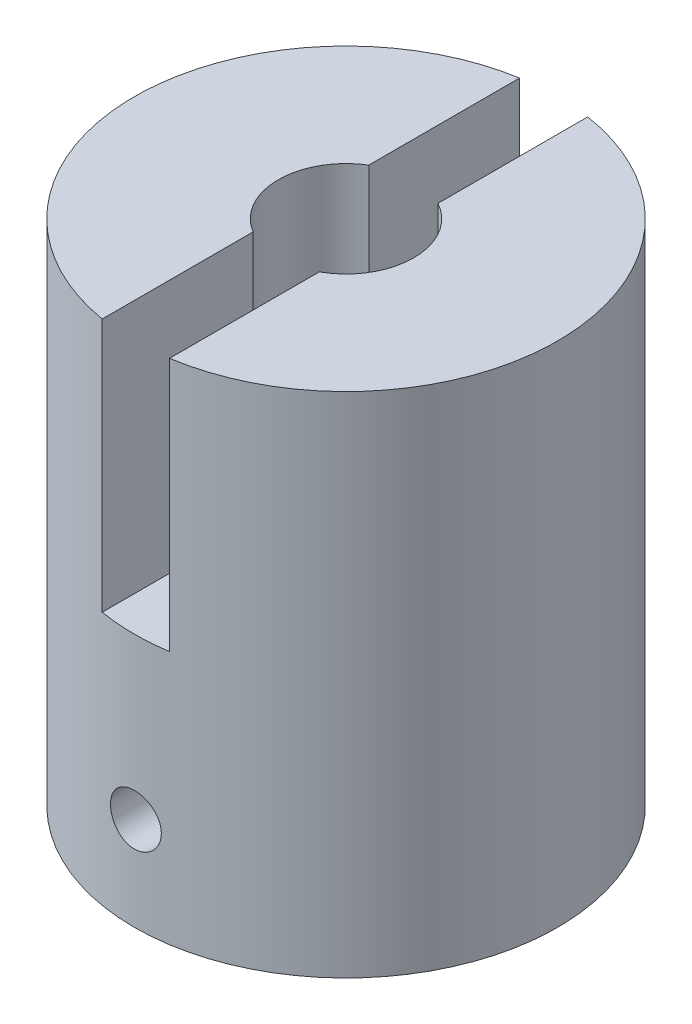
ISO-10303-21;
HEADER;
FILE_DESCRIPTION(('STEP AP214'),'2;1');
FILE_NAME('part.step','',(''),(''),'','','');
FILE_SCHEMA(('AUTOMOTIVE_DESIGN { 1 0 10303 214 1 1 1 1 }'));
ENDSEC;
DATA;
#1=APPLICATION_CONTEXT('core data for automotive mechanical design processes');
#2=APPLICATION_PROTOCOL_DEFINITION('international standard','automotive_design',2000,#1);
#3=PRODUCT_CONTEXT('',#1,'mechanical');
#4=PRODUCT('Part','Part','',(#3));
#5=PRODUCT_RELATED_PRODUCT_CATEGORY('part','',(#4));
#6=PRODUCT_DEFINITION_FORMATION('','',#4);
#7=PRODUCT_DEFINITION_CONTEXT('part definition',#1,'design');
#8=PRODUCT_DEFINITION('design','',#6,#7);
#9=PRODUCT_DEFINITION_SHAPE('','',#8);
#10=(LENGTH_UNIT() NAMED_UNIT(*) SI_UNIT(.MILLI.,.METRE.));
#11=(NAMED_UNIT(*) PLANE_ANGLE_UNIT() SI_UNIT($,.RADIAN.));
#12=(NAMED_UNIT(*) SI_UNIT($,.STERADIAN.) SOLID_ANGLE_UNIT());
#13=UNCERTAINTY_MEASURE_WITH_UNIT(LENGTH_MEASURE(1.E-05),#10,'distance_accuracy_value','');
#14=(GEOMETRIC_REPRESENTATION_CONTEXT(3) GLOBAL_UNCERTAINTY_ASSIGNED_CONTEXT((#13)) GLOBAL_UNIT_ASSIGNED_CONTEXT((#10,
#11,#12)) REPRESENTATION_CONTEXT('',''));
#15=CARTESIAN_POINT('',(0.,0.,0.));
#16=DIRECTION('',(0.,0.,1.));
#17=DIRECTION('',(1.,0.,0.));
#18=AXIS2_PLACEMENT_3D('',#15,#16,#17);
#19=CARTESIAN_POINT('',(0.,30.,0.));
#20=DIRECTION('',(0.,1.,0.));
#21=DIRECTION('',(0.,0.,1.));
#22=AXIS2_PLACEMENT_3D('',#19,#20,#21);
#23=PLANE('',#22);
#24=DIRECTION('',(0.,0.,-1.));
#25=VECTOR('',#24,1.);
#26=CARTESIAN_POINT('',(1.92622511346683,30.,-3.50566068127674));
#27=LINE('',#26,#25);
#28=CARTESIAN_POINT('',(1.92622511346683,30.,-3.50566068127674));
#29=VERTEX_POINT('',#28);
#30=CARTESIAN_POINT('',(1.92622511346683,30.,-12.3506945882509));
#31=VERTEX_POINT('',#30);
#32=EDGE_CURVE('E135',#29,#31,#27,.T.);
#33=ORIENTED_EDGE('',*,*,#32,.F.);
#34=CARTESIAN_POINT('',(0.,30.,0.));
#35=DIRECTION('',(0.,1.,0.));
#36=DIRECTION('',(0.,0.,1.));
#37=AXIS2_PLACEMENT_3D('',#34,#35,#36);
#38=CIRCLE('',#37,4.);
#39=CARTESIAN_POINT('',(1.92622511346683,30.,3.50566068127674));
#40=VERTEX_POINT('',#39);
#41=EDGE_CURVE('E142',#40,#29,#38,.T.);
#42=ORIENTED_EDGE('',*,*,#41,.F.);
#43=DIRECTION('',(0.,0.,-1.));
#44=VECTOR('',#43,1.);
#45=CARTESIAN_POINT('',(1.92622511346683,30.,0.));
#46=LINE('',#45,#44);
#47=CARTESIAN_POINT('',(1.92622511346683,30.,12.3506945882509));
#48=VERTEX_POINT('',#47);
#49=EDGE_CURVE('E167',#48,#40,#46,.T.);
#50=ORIENTED_EDGE('',*,*,#49,.F.);
#51=CARTESIAN_POINT('',(0.,30.,0.));
#52=DIRECTION('',(0.,1.,0.));
#53=DIRECTION('',(0.,0.,1.));
#54=AXIS2_PLACEMENT_3D('',#51,#52,#53);
#55=CIRCLE('',#54,12.5);
#56=EDGE_CURVE('E160',#48,#31,#55,.T.);
#57=ORIENTED_EDGE('',*,*,#56,.T.);
#58=EDGE_LOOP('',(#33,#42,#50,#57));
#59=FACE_BOUND('',#58,.T.);
#60=ADVANCED_FACE('F33',(#59),#23,.T.);
#61=CARTESIAN_POINT('',(0.,30.,0.));
#62=DIRECTION('',(0.,-1.,0.));
#63=DIRECTION('',(0.,0.,-1.));
#64=AXIS2_PLACEMENT_3D('',#61,#62,#63);
#65=CYLINDRICAL_SURFACE('',#64,12.5);
#66=CARTESIAN_POINT('',(1.5,5.51065962289375,12.4096736459909));
#67=CARTESIAN_POINT('',(1.49999641586388,5.42673005229857,12.4096748089167));
#68=CARTESIAN_POINT('',(1.49293206748169,5.34274736283305,12.4105342894214));
#69=CARTESIAN_POINT('',(1.46486159354819,5.17711731687797,12.4138782255216));
#70=CARTESIAN_POINT('',(1.44384072619508,5.09547252505324,12.4163643992983));
#71=CARTESIAN_POINT('',(1.38848417307918,4.93694042013684,12.4226761552619));
#72=CARTESIAN_POINT('',(1.35415731394874,4.86004999232564,12.426500849368));
#73=CARTESIAN_POINT('',(1.27318168778971,4.71313605184327,12.4350576249844));
#74=CARTESIAN_POINT('',(1.22653510106007,4.64311132710977,12.4397895458966));
#75=CARTESIAN_POINT('',(1.12198571965019,4.51153973708866,12.4496550027324));
#76=CARTESIAN_POINT('',(1.06403198625323,4.45003347571945,12.4547902908254));
#77=CARTESIAN_POINT('',(0.938622932174394,4.3375952638128,12.4648680792729));
#78=CARTESIAN_POINT('',(0.871167147527068,4.28666382992285,12.4698105701984));
#79=CARTESIAN_POINT('',(0.728414784233988,4.19667635642561,12.4789637011531));
#80=CARTESIAN_POINT('',(0.653094976924494,4.15765691502393,12.4831720690333));
#81=CARTESIAN_POINT('',(0.496912883636388,4.09283539270138,12.4903635621621));
#82=CARTESIAN_POINT('',(0.41605078804277,4.06703285801989,12.4933467294733));
#83=CARTESIAN_POINT('',(0.251493928492541,4.02949849484203,12.4977393662263));
#84=CARTESIAN_POINT('',(0.167814735521689,4.01769929617087,12.4991563682204));
#85=CARTESIAN_POINT('',(-0.000347248334283003,4.00829782323849,12.5002827183051));
#86=CARTESIAN_POINT('',(-0.0848300098341701,4.01069503181464,12.4999921286017));
#87=CARTESIAN_POINT('',(-0.251742833758765,4.02956418381943,12.4977421462633));
#88=CARTESIAN_POINT('',(-0.334181218784107,4.04596367537995,12.4957913442169));
#89=CARTESIAN_POINT('',(-0.495127185045589,4.09225869875175,12.490449821119));
#90=CARTESIAN_POINT('',(-0.573634696521302,4.12215446998457,12.4870590745233));
#91=CARTESIAN_POINT('',(-0.724715561629688,4.19467098734701,12.4792038952277));
#92=CARTESIAN_POINT('',(-0.797273648637692,4.23732324089696,12.4747368094346));
#93=CARTESIAN_POINT('',(-0.934229460099393,4.33411907237183,12.465229048358));
#94=CARTESIAN_POINT('',(-0.998626839383446,4.38826313610156,12.4601883488298));
#95=CARTESIAN_POINT('',(-1.11785860561525,4.50691179766398,12.4500603372648));
#96=CARTESIAN_POINT('',(-1.17263019439189,4.5714795135805,12.4449729316271));
#97=CARTESIAN_POINT('',(-1.27056795912578,4.7089253797335,12.4353563023037));
#98=CARTESIAN_POINT('',(-1.31373410365263,4.78180355247599,12.4308270801297));
#99=CARTESIAN_POINT('',(-1.38723839179325,4.93385586796744,12.4228396027608));
#100=CARTESIAN_POINT('',(-1.41757175578821,5.0130323435227,12.4193817467283));
#101=CARTESIAN_POINT('',(-1.46449505016189,5.17540580264434,12.4139364153306));
#102=CARTESIAN_POINT('',(-1.48108558929276,5.2586026079534,12.4119488748366));
#103=CARTESIAN_POINT('',(-1.49996964356083,5.4261011710821,12.4096810007818));
#104=CARTESIAN_POINT('',(-1.50235142135386,5.51039284083432,12.4093901280317));
#105=CARTESIAN_POINT('',(-1.49298299027801,5.67817401331522,12.4105206650573));
#106=CARTESIAN_POINT('',(-1.48123305845624,5.76166353173744,12.411942041265));
#107=CARTESIAN_POINT('',(-1.44400895971009,5.92520751469274,12.4163273137489));
#108=CARTESIAN_POINT('',(-1.41857731249469,6.00527179629841,12.4192864301079));
#109=CARTESIAN_POINT('',(-1.35475538396312,6.15999926438173,12.4264098926624));
#110=CARTESIAN_POINT('',(-1.31636468129306,6.23466227514527,12.4305742780457));
#111=CARTESIAN_POINT('',(-1.22749651360805,6.37686777038106,12.4396643656649));
#112=CARTESIAN_POINT('',(-1.17696103570738,6.4443737663344,12.4445936804928));
#113=CARTESIAN_POINT('',(-1.06532008918354,6.56997717939965,12.4546467770184));
#114=CARTESIAN_POINT('',(-1.0042142422181,6.62807425959669,12.4597705656719));
#115=CARTESIAN_POINT('',(-0.872782136333861,6.73351949651121,12.4696675472455));
#116=CARTESIAN_POINT('',(-0.802409249708916,6.78080974614946,12.4744387628015));
#117=CARTESIAN_POINT('',(-0.654668214705289,6.8628987275583,12.483063621558));
#118=CARTESIAN_POINT('',(-0.577300197822207,6.89769769408097,12.4869172820019));
#119=CARTESIAN_POINT('',(-0.417959622359992,6.95372012533165,12.4932640215257));
#120=CARTESIAN_POINT('',(-0.335999085323591,6.97497738283588,12.4957604851314));
#121=CARTESIAN_POINT('',(-0.169640292495739,7.00342299468483,12.4991255682254));
#122=CARTESIAN_POINT('',(-0.0852421377306301,7.01061193124032,12.4999942550783));
#123=CARTESIAN_POINT('',(0.0830300031278304,7.01070654494991,12.5000056524324));
#124=CARTESIAN_POINT('',(0.166903952329437,7.00370164123536,12.4991591682624));
#125=CARTESIAN_POINT('',(0.332273612398118,6.97579639544251,12.4958567701035));
#126=CARTESIAN_POINT('',(0.413769324044744,6.95489605791899,12.4934008566421));
#127=CARTESIAN_POINT('',(0.572059777991808,6.89982061532796,12.4871544009745));
#128=CARTESIAN_POINT('',(0.648855904373999,6.8656494406665,12.4833642539575));
#129=CARTESIAN_POINT('',(0.795637705262656,6.78501158810155,12.474869622158));
#130=CARTESIAN_POINT('',(0.865623324646851,6.73854481069232,12.4701651299761));
#131=CARTESIAN_POINT('',(0.997254742124292,6.63430278189062,12.4603319681132));
#132=CARTESIAN_POINT('',(1.0588476339384,6.57646094523087,12.4552009088046));
#133=CARTESIAN_POINT('',(1.17148865356204,6.45124810431753,12.4451123432295));
#134=CARTESIAN_POINT('',(1.22253427406543,6.38387484064309,12.4401548784622));
#135=CARTESIAN_POINT('',(1.31278537364373,6.2412381548085,12.4309559603764));
#136=CARTESIAN_POINT('',(1.35194799100155,6.16594745875727,12.4267171228205));
#137=CARTESIAN_POINT('',(1.41701902911872,6.00985074601836,12.419466118837));
#138=CARTESIAN_POINT('',(1.44294198213015,5.92905088729487,12.4164526081981));
#139=CARTESIAN_POINT('',(1.4745350503682,5.79162985334106,12.4127313618494));
#140=CARTESIAN_POINT('',(1.48407082470974,5.73587824691381,12.4115903654975));
#141=CARTESIAN_POINT('',(1.49680448454756,5.62364565682663,12.4100611186528));
#142=CARTESIAN_POINT('',(1.50000241299709,5.56716467811245,12.4096728630583));
#143=CARTESIAN_POINT('',(1.5,5.51065962289375,12.4096736459909));
#144=B_SPLINE_CURVE_WITH_KNOTS('',3,(#66,#67,#68,#69,#70,#71,#72,#73,#74,#75,#76,#77,#78,#79,
#80,#81,#82,#83,#84,#85,#86,#87,#88,#89,#90,#91,#92,#93,#94,#95,#96,#97,#98,#99,#100,#101,#102,
#103,#104,#105,#106,#107,#108,#109,#110,#111,#112,#113,#114,#115,#116,#117,#118,#119,#120,#121,
#122,#123,#124,#125,#126,#127,#128,#129,#130,#131,#132,#133,#134,#135,#136,#137,#138,#139,#140,
#141,#142,#143),.UNSPECIFIED.,.T.,.F.,(4,2,2,2,2,2,2,2,2,2,2,2,2,2,2,2,2,2,2,2,2,2,2,2,2,2,2,2,
2,2,2,2,2,2,2,2,2,2,4),(0.,0.25158230660961,0.503430774819312,0.755112462522263,1.0067496383611,
1.25954776660377,1.51235824273611,1.7659378087677,2.01950866836447,2.27185458608052,
2.52419131111312,2.77523023079344,3.02627360403336,3.27794222677635,3.52962149067919,
3.78288622204422,4.03615163930559,4.28951130338294,4.54285974404081,4.79463277043148,
5.0464008609825,5.29739099483104,5.54838929022027,5.80061125155309,6.05284224246468,
6.30639464647639,6.55994228515919,6.81285470170488,7.06575665136928,7.31707030939076,
7.56838388503438,7.81962308616498,8.07086432058376,8.32362252061906,8.57644073759112,
8.83016031080823,9.08360079205963,9.25297814464872,9.42235434931908),.UNSPECIFIED.);
#145=CARTESIAN_POINT('',(1.5,5.51065962289375,12.4096736459909));
#146=VERTEX_POINT('',#145);
#147=EDGE_CURVE('E224',#146,#146,#144,.T.);
#148=ORIENTED_EDGE('',*,*,#147,.T.);
#149=EDGE_LOOP('',(#148));
#150=FACE_BOUND('',#149,.T.);
#151=CARTESIAN_POINT('',(0.,15.,0.));
#152=DIRECTION('',(0.,1.,0.));
#153=DIRECTION('',(0.,0.,1.));
#154=AXIS2_PLACEMENT_3D('',#151,#152,#153);
#155=CIRCLE('',#154,12.5);
#156=CARTESIAN_POINT('',(1.92622511346683,15.,-12.3506945882509));
#157=VERTEX_POINT('',#156);
#158=CARTESIAN_POINT('',(-2.07377488653317,15.,-12.3267780753928));
#159=VERTEX_POINT('',#158);
#160=EDGE_CURVE('E11',#157,#159,#155,.T.);
#161=ORIENTED_EDGE('',*,*,#160,.F.);
#162=DIRECTION('',(0.,-1.,0.));
#163=VECTOR('',#162,1.);
#164=CARTESIAN_POINT('',(1.92622511346683,30.,-12.3506945882509));
#165=LINE('',#164,#163);
#166=EDGE_CURVE('E63',#157,#31,#165,.F.);
#167=ORIENTED_EDGE('',*,*,#166,.T.);
#168=ORIENTED_EDGE('',*,*,#56,.F.);
#169=DIRECTION('',(0.,-1.,0.));
#170=VECTOR('',#169,1.);
#171=CARTESIAN_POINT('',(1.92622511346683,30.,12.3506945882509));
#172=LINE('',#171,#170);
#173=CARTESIAN_POINT('',(1.92622511346683,15.,12.3506945882509));
#174=VERTEX_POINT('',#173);
#175=EDGE_CURVE('E155',#48,#174,#172,.T.);
#176=ORIENTED_EDGE('',*,*,#175,.T.);
#177=CARTESIAN_POINT('',(-2.07377488653317,15.,12.3267780753928));
#178=VERTEX_POINT('',#177);
#179=EDGE_CURVE('E48',#178,#174,#155,.T.);
#180=ORIENTED_EDGE('',*,*,#179,.F.);
#181=DIRECTION('',(0.,-1.,0.));
#182=VECTOR('',#181,1.);
#183=CARTESIAN_POINT('',(-2.07377488653317,30.,12.3267780753928));
#184=LINE('',#183,#182);
#185=CARTESIAN_POINT('',(-2.07377488653317,30.,12.3267780753928));
#186=VERTEX_POINT('',#185);
#187=EDGE_CURVE('E152',#178,#186,#184,.F.);
#188=ORIENTED_EDGE('',*,*,#187,.T.);
#189=CARTESIAN_POINT('',(-2.07377488653317,30.,-12.3267780753928));
#190=VERTEX_POINT('',#189);
#191=EDGE_CURVE('E163',#190,#186,#55,.T.);
#192=ORIENTED_EDGE('',*,*,#191,.F.);
#193=DIRECTION('',(0.,-1.,0.));
#194=VECTOR('',#193,1.);
#195=CARTESIAN_POINT('',(-2.07377488653317,30.,-12.3267780753928));
#196=LINE('',#195,#194);
#197=EDGE_CURVE('E55',#190,#159,#196,.T.);
#198=ORIENTED_EDGE('',*,*,#197,.T.);
#199=EDGE_LOOP('',(#161,#167,#168,#176,#180,#188,#192,#198));
#200=FACE_BOUND('',#199,.T.);
#201=CARTESIAN_POINT('',(0.,0.,0.));
#202=DIRECTION('',(0.,1.,0.));
#203=DIRECTION('',(0.,0.,1.));
#204=AXIS2_PLACEMENT_3D('',#201,#202,#203);
#205=CIRCLE('',#204,12.5);
#206=CARTESIAN_POINT('',(0.,0.,12.5));
#207=VERTEX_POINT('',#206);
#208=EDGE_CURVE('E159',#207,#207,#205,.T.);
#209=ORIENTED_EDGE('',*,*,#208,.T.);
#210=EDGE_LOOP('',(#209));
#211=FACE_BOUND('',#210,.T.);
#212=ADVANCED_FACE('F35',(#150,#200,#211),#65,.T.);
#213=DIRECTION('',(0.,0.,1.));
#214=VECTOR('',#213,1.);
#215=CARTESIAN_POINT('',(-2.07377488653317,30.,12.7723743770767));
#216=LINE('',#215,#214);
#217=CARTESIAN_POINT('',(-2.07377488653317,30.,3.42044700587282));
#218=VERTEX_POINT('',#217);
#219=EDGE_CURVE('E140',#218,#186,#216,.T.);
#220=ORIENTED_EDGE('',*,*,#219,.F.);
#221=CARTESIAN_POINT('',(0.,30.,0.));
#222=DIRECTION('',(0.,1.,0.));
#223=DIRECTION('',(0.,0.,1.));
#224=AXIS2_PLACEMENT_3D('',#221,#222,#223);
#225=CIRCLE('',#224,4.);
#226=CARTESIAN_POINT('',(-2.07377488653317,30.,-3.42044700587282));
#227=VERTEX_POINT('',#226);
#228=EDGE_CURVE('E137',#227,#218,#225,.T.);
#229=ORIENTED_EDGE('',*,*,#228,.F.);
#230=DIRECTION('',(0.,0.,1.));
#231=VECTOR('',#230,1.);
#232=CARTESIAN_POINT('',(-2.07377488653317,30.,0.));
#233=LINE('',#232,#231);
#234=EDGE_CURVE('E117',#190,#227,#233,.T.);
#235=ORIENTED_EDGE('',*,*,#234,.F.);
#236=ORIENTED_EDGE('',*,*,#191,.T.);
#237=EDGE_LOOP('',(#220,#229,#235,#236));
#238=FACE_BOUND('',#237,.T.);
#239=ADVANCED_FACE('F187',(#238),#23,.T.);
#240=CARTESIAN_POINT('',(0.,0.,0.));
#241=DIRECTION('',(0.,1.,0.));
#242=DIRECTION('',(0.,0.,1.));
#243=AXIS2_PLACEMENT_3D('',#240,#241,#242);
#244=PLANE('',#243);
#245=CARTESIAN_POINT('',(0.,0.,0.));
#246=DIRECTION('',(0.,-1.,0.));
#247=DIRECTION('',(0.,0.,-1.));
#248=AXIS2_PLACEMENT_3D('',#245,#246,#247);
#249=CIRCLE('',#248,3.5);
#250=CARTESIAN_POINT('',(0.,0.,-3.5));
#251=VERTEX_POINT('',#250);
#252=EDGE_CURVE('E221',#251,#251,#249,.T.);
#253=ORIENTED_EDGE('',*,*,#252,.F.);
#254=EDGE_LOOP('',(#253));
#255=FACE_BOUND('',#254,.T.);
#256=ORIENTED_EDGE('',*,*,#208,.F.);
#257=EDGE_LOOP('',(#256));
#258=FACE_BOUND('',#257,.T.);
#259=ADVANCED_FACE('F208',(#255,#258),#244,.F.);
#260=CARTESIAN_POINT('',(0.,15.,0.));
#261=DIRECTION('',(0.,1.,0.));
#262=DIRECTION('',(0.,0.,1.));
#263=AXIS2_PLACEMENT_3D('',#260,#261,#262);
#264=PLANE('',#263);
#265=CARTESIAN_POINT('',(0.,15.,0.));
#266=DIRECTION('',(0.,-1.,0.));
#267=DIRECTION('',(0.,0.,-1.));
#268=AXIS2_PLACEMENT_3D('',#265,#266,#267);
#269=CIRCLE('',#268,3.5);
#270=CARTESIAN_POINT('',(0.,15.,-3.5));
#271=VERTEX_POINT('',#270);
#272=EDGE_CURVE('E138',#271,#271,#269,.T.);
#273=ORIENTED_EDGE('',*,*,#272,.T.);
#274=EDGE_LOOP('',(#273));
#275=FACE_BOUND('',#274,.T.);
#276=ORIENTED_EDGE('',*,*,#160,.T.);
#277=DIRECTION('',(0.,0.,1.));
#278=VECTOR('',#277,1.);
#279=CARTESIAN_POINT('',(-2.07377488653317,15.,-3.42044700587282));
#280=LINE('',#279,#278);
#281=CARTESIAN_POINT('',(-2.07377488653317,15.,-3.42044700587282));
#282=VERTEX_POINT('',#281);
#283=EDGE_CURVE('E105',#159,#282,#280,.T.);
#284=ORIENTED_EDGE('',*,*,#283,.T.);
#285=CARTESIAN_POINT('',(0.,15.,0.));
#286=DIRECTION('',(0.,1.,0.));
#287=DIRECTION('',(0.,0.,1.));
#288=AXIS2_PLACEMENT_3D('',#285,#286,#287);
#289=CIRCLE('',#288,4.);
#290=CARTESIAN_POINT('',(-2.07377488653317,15.,3.42044700587282));
#291=VERTEX_POINT('',#290);
#292=EDGE_CURVE('E110',#282,#291,#289,.T.);
#293=ORIENTED_EDGE('',*,*,#292,.T.);
#294=DIRECTION('',(0.,0.,1.));
#295=VECTOR('',#294,1.);
#296=CARTESIAN_POINT('',(-2.07377488653317,15.,12.7723743770767));
#297=LINE('',#296,#295);
#298=EDGE_CURVE('E126',#291,#178,#297,.T.);
#299=ORIENTED_EDGE('',*,*,#298,.T.);
#300=ORIENTED_EDGE('',*,*,#179,.T.);
#301=DIRECTION('',(0.,0.,-1.));
#302=VECTOR('',#301,1.);
#303=CARTESIAN_POINT('',(1.92622511346683,15.,12.7723743770767));
#304=LINE('',#303,#302);
#305=CARTESIAN_POINT('',(1.92622511346683,15.,3.50566068127674));
#306=VERTEX_POINT('',#305);
#307=EDGE_CURVE('E128',#174,#306,#304,.T.);
#308=ORIENTED_EDGE('',*,*,#307,.T.);
#309=CARTESIAN_POINT('',(0.,15.,0.));
#310=DIRECTION('',(0.,1.,0.));
#311=DIRECTION('',(0.,0.,1.));
#312=AXIS2_PLACEMENT_3D('',#309,#310,#311);
#313=CIRCLE('',#312,4.);
#314=CARTESIAN_POINT('',(1.92622511346683,15.,-3.50566068127674));
#315=VERTEX_POINT('',#314);
#316=EDGE_CURVE('E122',#306,#315,#313,.T.);
#317=ORIENTED_EDGE('',*,*,#316,.T.);
#318=DIRECTION('',(0.,0.,-1.));
#319=VECTOR('',#318,1.);
#320=CARTESIAN_POINT('',(1.92622511346683,15.,-3.50566068127674));
#321=LINE('',#320,#319);
#322=EDGE_CURVE('E112',#315,#157,#321,.T.);
#323=ORIENTED_EDGE('',*,*,#322,.T.);
#324=EDGE_LOOP('',(#276,#284,#293,#299,#300,#308,#317,#323));
#325=FACE_BOUND('',#324,.T.);
#326=ADVANCED_FACE('F107',(#275,#325),#264,.T.);
#327=CARTESIAN_POINT('',(1.92622511346683,15.,-3.50566068127674));
#328=DIRECTION('',(1.,0.,0.));
#329=DIRECTION('',(0.,0.,-1.));
#330=AXIS2_PLACEMENT_3D('',#327,#328,#329);
#331=PLANE('',#330);
#332=ORIENTED_EDGE('',*,*,#322,.F.);
#333=DIRECTION('',(0.,1.,0.));
#334=VECTOR('',#333,1.);
#335=CARTESIAN_POINT('',(1.92622511346683,15.,-3.50566068127674));
#336=LINE('',#335,#334);
#337=EDGE_CURVE('E145',#315,#29,#336,.T.);
#338=ORIENTED_EDGE('',*,*,#337,.T.);
#339=ORIENTED_EDGE('',*,*,#32,.T.);
#340=ORIENTED_EDGE('',*,*,#166,.F.);
#341=EDGE_LOOP('',(#332,#338,#339,#340));
#342=FACE_BOUND('',#341,.T.);
#343=ADVANCED_FACE('F197',(#342),#331,.F.);
#344=CARTESIAN_POINT('',(1.92622511346683,15.,12.7723743770767));
#345=DIRECTION('',(1.,0.,0.));
#346=DIRECTION('',(0.,0.,-1.));
#347=AXIS2_PLACEMENT_3D('',#344,#345,#346);
#348=PLANE('',#347);
#349=ORIENTED_EDGE('',*,*,#49,.T.);
#350=DIRECTION('',(0.,1.,0.));
#351=VECTOR('',#350,1.);
#352=CARTESIAN_POINT('',(1.92622511346683,15.,3.50566068127674));
#353=LINE('',#352,#351);
#354=EDGE_CURVE('E147',#306,#40,#353,.T.);
#355=ORIENTED_EDGE('',*,*,#354,.F.);
#356=ORIENTED_EDGE('',*,*,#307,.F.);
#357=ORIENTED_EDGE('',*,*,#175,.F.);
#358=EDGE_LOOP('',(#349,#355,#356,#357));
#359=FACE_BOUND('',#358,.T.);
#360=ADVANCED_FACE('F173',(#359),#348,.F.);
#361=CARTESIAN_POINT('',(-2.07377488653317,15.,12.7723743770767));
#362=DIRECTION('',(-1.,0.,0.));
#363=DIRECTION('',(0.,0.,1.));
#364=AXIS2_PLACEMENT_3D('',#361,#362,#363);
#365=PLANE('',#364);
#366=ORIENTED_EDGE('',*,*,#298,.F.);
#367=DIRECTION('',(0.,1.,0.));
#368=VECTOR('',#367,1.);
#369=CARTESIAN_POINT('',(-2.07377488653317,15.,3.42044700587282));
#370=LINE('',#369,#368);
#371=EDGE_CURVE('E121',#291,#218,#370,.T.);
#372=ORIENTED_EDGE('',*,*,#371,.T.);
#373=ORIENTED_EDGE('',*,*,#219,.T.);
#374=ORIENTED_EDGE('',*,*,#187,.F.);
#375=EDGE_LOOP('',(#366,#372,#373,#374));
#376=FACE_BOUND('',#375,.T.);
#377=ADVANCED_FACE('F189',(#376),#365,.F.);
#378=CARTESIAN_POINT('',(-2.07377488653317,15.,-3.42044700587282));
#379=DIRECTION('',(-1.,0.,0.));
#380=DIRECTION('',(0.,0.,1.));
#381=AXIS2_PLACEMENT_3D('',#378,#379,#380);
#382=PLANE('',#381);
#383=ORIENTED_EDGE('',*,*,#234,.T.);
#384=DIRECTION('',(0.,1.,0.));
#385=VECTOR('',#384,1.);
#386=CARTESIAN_POINT('',(-2.07377488653317,15.,-3.42044700587282));
#387=LINE('',#386,#385);
#388=EDGE_CURVE('E115',#282,#227,#387,.T.);
#389=ORIENTED_EDGE('',*,*,#388,.F.);
#390=ORIENTED_EDGE('',*,*,#283,.F.);
#391=ORIENTED_EDGE('',*,*,#197,.F.);
#392=EDGE_LOOP('',(#383,#389,#390,#391));
#393=FACE_BOUND('',#392,.T.);
#394=ADVANCED_FACE('F116',(#393),#382,.F.);
#395=CARTESIAN_POINT('',(0.,15.,0.));
#396=DIRECTION('',(0.,1.,0.));
#397=DIRECTION('',(0.,0.,1.));
#398=AXIS2_PLACEMENT_3D('',#395,#396,#397);
#399=CYLINDRICAL_SURFACE('',#398,4.);
#400=ORIENTED_EDGE('',*,*,#41,.T.);
#401=ORIENTED_EDGE('',*,*,#337,.F.);
#402=ORIENTED_EDGE('',*,*,#316,.F.);
#403=ORIENTED_EDGE('',*,*,#354,.T.);
#404=EDGE_LOOP('',(#400,#401,#402,#403));
#405=FACE_BOUND('',#404,.T.);
#406=ADVANCED_FACE('F182',(#405),#399,.F.);
#407=CARTESIAN_POINT('',(0.,15.,0.));
#408=DIRECTION('',(0.,1.,0.));
#409=DIRECTION('',(0.,0.,1.));
#410=AXIS2_PLACEMENT_3D('',#407,#408,#409);
#411=CYLINDRICAL_SURFACE('',#410,4.);
#412=ORIENTED_EDGE('',*,*,#228,.T.);
#413=ORIENTED_EDGE('',*,*,#371,.F.);
#414=ORIENTED_EDGE('',*,*,#292,.F.);
#415=ORIENTED_EDGE('',*,*,#388,.T.);
#416=EDGE_LOOP('',(#412,#413,#414,#415));
#417=FACE_BOUND('',#416,.T.);
#418=ADVANCED_FACE('F124',(#417),#411,.F.);
#419=CARTESIAN_POINT('',(0.,15.,0.));
#420=DIRECTION('',(0.,-1.,0.));
#421=DIRECTION('',(0.,0.,-1.));
#422=AXIS2_PLACEMENT_3D('',#419,#420,#421);
#423=CYLINDRICAL_SURFACE('',#422,3.5);
#424=CARTESIAN_POINT('',(1.5,5.51065962289375,3.16227766016838));
#425=CARTESIAN_POINT('',(1.49999038492545,5.59042855593913,3.16228717298615));
#426=CARTESIAN_POINT('',(1.49359660659694,5.67031776453566,3.16534018013075));
#427=CARTESIAN_POINT('',(1.46827542593982,5.82777628596739,3.17716042981265));
#428=CARTESIAN_POINT('',(1.44931491353816,5.9053389030323,3.18594276667924));
#429=CARTESIAN_POINT('',(1.39974825661799,6.05557556469155,3.20802619745321));
#430=CARTESIAN_POINT('',(1.3691914561727,6.12826880823812,3.22130811955254));
#431=CARTESIAN_POINT('',(1.29744502147729,6.2674775523294,3.25086693275557));
#432=CARTESIAN_POINT('',(1.25625747429105,6.33399426199051,3.26714323581242));
#433=CARTESIAN_POINT('',(1.16151711863134,6.46338453851028,3.3020556513051));
#434=CARTESIAN_POINT('',(1.10737213961854,6.5258023537091,3.32077467653238));
#435=CARTESIAN_POINT('',(0.989495816865005,6.64101095529417,3.35778390832689));
#436=CARTESIAN_POINT('',(0.925760668427734,6.69379790236493,3.37607394135677));
#437=CARTESIAN_POINT('',(0.786887444118554,6.79061912752948,3.41118222051011));
#438=CARTESIAN_POINT('',(0.711357726755067,6.83413421802436,3.42789293367331));
#439=CARTESIAN_POINT('',(0.553203581147163,6.90764173710962,3.4569371087723));
#440=CARTESIAN_POINT('',(0.470582497238455,6.93764049882635,3.46927262014747));
#441=CARTESIAN_POINT('',(0.305382130945827,6.98159213345485,3.48758735586712));
#442=CARTESIAN_POINT('',(0.223047558846187,6.99633265537662,3.49387724164572));
#443=CARTESIAN_POINT('',(0.0568497000057556,7.01190097328813,3.50052462942354));
#444=CARTESIAN_POINT('',(-0.0270129128697493,7.01273476027191,3.50088468598068));
#445=CARTESIAN_POINT('',(-0.188134207596874,7.00086449850356,3.49581016618033));
#446=CARTESIAN_POINT('',(-0.265470719086093,6.98902772291925,3.49074679776828));
#447=CARTESIAN_POINT('',(-0.416935858912366,6.95364758856633,3.47591102813446));
#448=CARTESIAN_POINT('',(-0.491064249746499,6.93010336468039,3.46613827891648));
#449=CARTESIAN_POINT('',(-0.635378985342392,6.87170632803094,3.44263346664963));
#450=CARTESIAN_POINT('',(-0.70548764730497,6.83668597671892,3.42884310391306));
#451=CARTESIAN_POINT('',(-0.839017665141777,6.75650094521587,3.39863837501696));
#452=CARTESIAN_POINT('',(-0.902436606512514,6.71133262062798,3.38222306678434));
#453=CARTESIAN_POINT('',(-1.02577392003805,6.60825486955082,3.34696895152063));
#454=CARTESIAN_POINT('',(-1.08508648843663,6.54965018799817,3.32804069559209));
#455=CARTESIAN_POINT('',(-1.19331308888253,6.42330820707757,3.29078815665823));
#456=CARTESIAN_POINT('',(-1.24222263226406,6.35556698601982,3.27246413723674));
#457=CARTESIAN_POINT('',(-1.32993971380651,6.20976968563256,3.23783417736942));
#458=CARTESIAN_POINT('',(-1.36831384702014,6.13142755004876,3.22162619167355));
#459=CARTESIAN_POINT('',(-1.43107385954865,5.9685151186147,3.19424697319981));
#460=CARTESIAN_POINT('',(-1.45547041320372,5.88394963123325,3.18307189830842));
#461=CARTESIAN_POINT('',(-1.48799335058118,5.71707322511017,3.16799275229804));
#462=CARTESIAN_POINT('',(-1.49710640039855,5.6349951325961,3.16364898851198));
#463=CARTESIAN_POINT('',(-1.50171565988816,5.47038513533361,3.16146494308516));
#464=CARTESIAN_POINT('',(-1.49721705457354,5.38785341533843,3.16362218505066));
#465=CARTESIAN_POINT('',(-1.47563239208818,5.23072833602351,3.17374071577831));
#466=CARTESIAN_POINT('',(-1.45944230541441,5.15598175270836,3.18128847435202));
#467=CARTESIAN_POINT('',(-1.41614006363835,5.01033688470841,3.2007978650071));
#468=CARTESIAN_POINT('',(-1.38902525529709,4.93943953962099,3.21276056926751));
#469=CARTESIAN_POINT('',(-1.32334189052693,4.80005467774874,3.24038333624188));
#470=CARTESIAN_POINT('',(-1.28432659707742,4.73180596198442,3.25618154123646));
#471=CARTESIAN_POINT('',(-1.19638562157086,4.60248427013642,3.28950916992048));
#472=CARTESIAN_POINT('',(-1.14745548114547,4.54141454178852,3.3070393706057));
#473=CARTESIAN_POINT('',(-1.03605747720159,4.42264516011414,3.34369698282831));
#474=CARTESIAN_POINT('',(-0.972781802419172,4.365702004308,3.36283055507213));
#475=CARTESIAN_POINT('',(-0.837142334524679,4.26309250423021,3.39913473749074));
#476=CARTESIAN_POINT('',(-0.764777632276176,4.21742728939991,3.41630515097051));
#477=CARTESIAN_POINT('',(-0.612290393672595,4.1386182780885,3.44690719585056));
#478=CARTESIAN_POINT('',(-0.532131490582581,4.10553710011787,3.46032004460384));
#479=CARTESIAN_POINT('',(-0.366659881518581,4.05358472344815,3.48173830246699));
#480=CARTESIAN_POINT('',(-0.28135047765041,4.03470452251825,3.48974713693762));
#481=CARTESIAN_POINT('',(-0.114740191834882,4.01287089408636,3.49904040627988));
#482=CARTESIAN_POINT('',(-0.0336030421543036,4.00885271721601,3.50077418524232));
#483=CARTESIAN_POINT('',(0.12816980880715,4.01395737768284,3.49858700907225));
#484=CARTESIAN_POINT('',(0.208805604242758,4.02307766784366,3.49466715001972));
#485=CARTESIAN_POINT('',(0.364022405138258,4.05343639136479,3.48185611932799));
#486=CARTESIAN_POINT('',(0.438716867066027,4.07418660660356,3.47316550610207));
#487=CARTESIAN_POINT('',(0.583524431853923,4.12666765481552,3.45179100848821));
#488=CARTESIAN_POINT('',(0.653636688669971,4.15840050881777,3.43910638916064));
#489=CARTESIAN_POINT('',(0.79082085538958,4.23355480080574,3.41024047270082));
#490=CARTESIAN_POINT('',(0.857608099366119,4.27744347550692,3.39392604407178));
#491=CARTESIAN_POINT('',(0.98315957617543,4.37499958762295,3.35970811620735));
#492=CARTESIAN_POINT('',(1.0419206185,4.4286708940715,3.341803989688));
#493=CARTESIAN_POINT('',(1.15419921481671,4.54885513150312,3.30477972078024));
#494=CARTESIAN_POINT('',(1.20702595263291,4.61601763101386,3.28566570654981));
#495=CARTESIAN_POINT('',(1.30078077887623,4.75881888043595,3.24969238680823));
#496=CARTESIAN_POINT('',(1.34170194259386,4.83446252799701,3.23283439654742));
#497=CARTESIAN_POINT('',(1.41018371094568,4.99223319280905,3.20355631016088));
#498=CARTESIAN_POINT('',(1.43776832759537,5.07434824602881,3.19112824877803));
#499=CARTESIAN_POINT('',(1.47837340972956,5.24261480280923,3.17252771438391));
#500=CARTESIAN_POINT('',(1.49144272805064,5.32875174384703,3.16633426473114));
#501=CARTESIAN_POINT('',(1.49899243118201,5.44705846781542,3.16275406284903));
#502=CARTESIAN_POINT('',(1.50000383428566,5.47884948198412,3.16227386666053));
#503=CARTESIAN_POINT('',(1.5,5.51065962289375,3.16227766016838));
#504=B_SPLINE_CURVE_WITH_KNOTS('',3,(#424,#425,#426,#427,#428,#429,#430,#431,#432,#433,#434,
#435,#436,#437,#438,#439,#440,#441,#442,#443,#444,#445,#446,#447,#448,#449,#450,#451,#452,#453,
#454,#455,#456,#457,#458,#459,#460,#461,#462,#463,#464,#465,#466,#467,#468,#469,#470,#471,#472,
#473,#474,#475,#476,#477,#478,#479,#480,#481,#482,#483,#484,#485,#486,#487,#488,#489,#490,#491,
#492,#493,#494,#495,#496,#497,#498,#499,#500,#501,#502,#503),.UNSPECIFIED.,.T.,.F.,(4,2,2,2,2,2,
2,2,2,2,2,2,2,2,2,2,2,2,2,2,2,2,2,2,2,2,2,2,2,2,2,2,2,2,2,2,2,2,2,4),(0.,0.239211516998636,
0.479055812925296,0.717890772651921,0.956678879115817,1.20974703533054,1.46291585698786,
1.72782087173741,1.992601634844,2.24290515697656,2.49310084605822,2.72720452587285,
2.96132550725882,3.19902917219044,3.43681833943188,3.69219429883402,3.94768022455396,
4.21248245374587,4.47708218938959,4.72382987542101,4.97048358104408,5.20000580849601,
5.42958381263239,5.66914358774548,5.9088113247203,6.16934837221378,6.42991150089539,
6.69175474679387,6.95343186577332,7.19595274449671,7.43842661162275,7.67141114258535,
7.90443857025996,8.14809791325949,8.39185383353303,8.65331392763672,8.91492579368383,
9.17606486564864,9.43632235654433,9.53171478279883),.UNSPECIFIED.);
#505=CARTESIAN_POINT('',(1.5,5.51065962289375,3.16227766016838));
#506=VERTEX_POINT('',#505);
#507=EDGE_CURVE('E38',#506,#506,#504,.T.);
#508=ORIENTED_EDGE('',*,*,#507,.T.);
#509=EDGE_LOOP('',(#508));
#510=FACE_BOUND('',#509,.T.);
#511=ORIENTED_EDGE('',*,*,#272,.F.);
#512=EDGE_LOOP('',(#511));
#513=FACE_BOUND('',#512,.T.);
#514=ORIENTED_EDGE('',*,*,#252,.T.);
#515=EDGE_LOOP('',(#514));
#516=FACE_BOUND('',#515,.T.);
#517=ADVANCED_FACE('F236',(#510,#513,#516),#423,.F.);
#518=CARTESIAN_POINT('',(0.,5.51065962289375,0.));
#519=DIRECTION('',(0.,0.,1.));
#520=DIRECTION('',(1.,0.,0.));
#521=AXIS2_PLACEMENT_3D('',#518,#519,#520);
#522=CYLINDRICAL_SURFACE('',#521,1.5);
#523=ORIENTED_EDGE('',*,*,#507,.F.);
#524=EDGE_LOOP('',(#523));
#525=FACE_BOUND('',#524,.T.);
#526=ORIENTED_EDGE('',*,*,#147,.F.);
#527=EDGE_LOOP('',(#526));
#528=FACE_BOUND('',#527,.T.);
#529=ADVANCED_FACE('F233',(#525,#528),#522,.F.);
#530=CLOSED_SHELL('',(#60,#212,#239,#259,#326,#343,#360,#377,#394,#406,#418,#517,#529));
#531=MANIFOLD_SOLID_BREP('B2',#530);
#532=ADVANCED_BREP_SHAPE_REPRESENTATION('',(#18,#531),#14);
#533=SHAPE_DEFINITION_REPRESENTATION(#9,#532);
ENDSEC;
END-ISO-10303-21;
